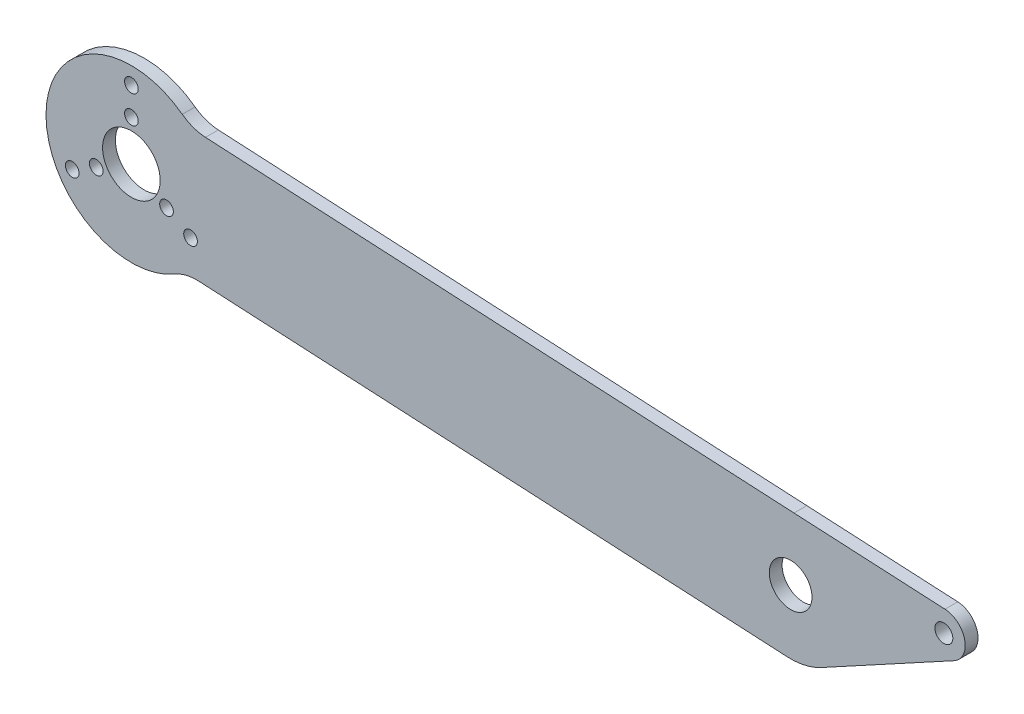
ISO-10303-21;
HEADER;
FILE_DESCRIPTION(('STEP AP214'),'2;1');
FILE_NAME('part.step','',(''),(''),'','','');
FILE_SCHEMA(('AUTOMOTIVE_DESIGN { 1 0 10303 214 1 1 1 1 }'));
ENDSEC;
DATA;
#1=APPLICATION_CONTEXT('core data for automotive mechanical design processes');
#2=APPLICATION_PROTOCOL_DEFINITION('international standard','automotive_design',2000,#1);
#3=PRODUCT_CONTEXT('',#1,'mechanical');
#4=PRODUCT('Part','Part','',(#3));
#5=PRODUCT_RELATED_PRODUCT_CATEGORY('part','',(#4));
#6=PRODUCT_DEFINITION_FORMATION('','',#4);
#7=PRODUCT_DEFINITION_CONTEXT('part definition',#1,'design');
#8=PRODUCT_DEFINITION('design','',#6,#7);
#9=PRODUCT_DEFINITION_SHAPE('','',#8);
#10=(LENGTH_UNIT() NAMED_UNIT(*) SI_UNIT(.MILLI.,.METRE.));
#11=(NAMED_UNIT(*) PLANE_ANGLE_UNIT() SI_UNIT($,.RADIAN.));
#12=(NAMED_UNIT(*) SI_UNIT($,.STERADIAN.) SOLID_ANGLE_UNIT());
#13=UNCERTAINTY_MEASURE_WITH_UNIT(LENGTH_MEASURE(1.E-05),#10,'distance_accuracy_value','');
#14=(GEOMETRIC_REPRESENTATION_CONTEXT(3) GLOBAL_UNCERTAINTY_ASSIGNED_CONTEXT((#13)) GLOBAL_UNIT_ASSIGNED_CONTEXT((#10,
#11,#12)) REPRESENTATION_CONTEXT('',''));
#15=CARTESIAN_POINT('',(0.,0.,0.));
#16=DIRECTION('',(0.,0.,1.));
#17=DIRECTION('',(1.,0.,0.));
#18=AXIS2_PLACEMENT_3D('',#15,#16,#17);
#19=CARTESIAN_POINT('',(15.241508082376,-25.839822587914,3.));
#20=DIRECTION('',(0.,0.,-1.));
#21=DIRECTION('',(-1.,0.,0.));
#22=AXIS2_PLACEMENT_3D('',#19,#20,#21);
#23=CYLINDRICAL_SURFACE('',#22,10.);
#24=DIRECTION('',(0.,0.,1.));
#25=VECTOR('',#24,1.);
#26=CARTESIAN_POINT('',(15.7689222913527,-15.853740560804,3.));
#27=LINE('',#26,#25);
#28=CARTESIAN_POINT('',(15.7689222913527,-15.853740560804,3.));
#29=VERTEX_POINT('',#28);
#30=CARTESIAN_POINT('',(15.7689222913527,-15.853740560804,0.));
#31=VERTEX_POINT('',#30);
#32=EDGE_CURVE('E154',#29,#31,#27,.F.);
#33=ORIENTED_EDGE('',*,*,#32,.F.);
#34=CARTESIAN_POINT('',(15.241508082376,-25.839822587914,3.));
#35=DIRECTION('',(0.,0.,1.));
#36=DIRECTION('',(1.,0.,0.));
#37=AXIS2_PLACEMENT_3D('',#34,#35,#36);
#38=CIRCLE('',#37,10.);
#39=CARTESIAN_POINT('',(10.1610053882507,-17.2265483919426,3.));
#40=VERTEX_POINT('',#39);
#41=EDGE_CURVE('E51',#29,#40,#38,.T.);
#42=ORIENTED_EDGE('',*,*,#41,.T.);
#43=DIRECTION('',(0.,0.,-1.));
#44=VECTOR('',#43,1.);
#45=CARTESIAN_POINT('',(10.1610053882507,-17.2265483919427,3.));
#46=LINE('',#45,#44);
#47=CARTESIAN_POINT('',(10.1610053882507,-17.2265483919426,0.));
#48=VERTEX_POINT('',#47);
#49=EDGE_CURVE('E157',#48,#40,#46,.F.);
#50=ORIENTED_EDGE('',*,*,#49,.F.);
#51=CARTESIAN_POINT('',(15.241508082376,-25.839822587914,0.));
#52=DIRECTION('',(0.,0.,1.));
#53=DIRECTION('',(1.,0.,0.));
#54=AXIS2_PLACEMENT_3D('',#51,#52,#53);
#55=CIRCLE('',#54,10.);
#56=EDGE_CURVE('E11',#48,#31,#55,.F.);
#57=ORIENTED_EDGE('',*,*,#56,.T.);
#58=EDGE_LOOP('',(#33,#42,#50,#57));
#59=FACE_BOUND('',#58,.T.);
#60=ADVANCED_FACE('F44',(#59),#23,.F.);
#61=CARTESIAN_POINT('',(17.8785791272596,24.0905875476361,3.));
#62=DIRECTION('',(0.,0.,-1.));
#63=DIRECTION('',(-1.,0.,0.));
#64=AXIS2_PLACEMENT_3D('',#61,#62,#63);
#65=CYLINDRICAL_SURFACE('',#64,10.);
#66=DIRECTION('',(0.,0.,-1.));
#67=VECTOR('',#66,1.);
#68=CARTESIAN_POINT('',(11.9190527515064,16.0603916984241,3.));
#69=LINE('',#68,#67);
#70=CARTESIAN_POINT('',(11.9190527515064,16.0603916984241,3.));
#71=VERTEX_POINT('',#70);
#72=CARTESIAN_POINT('',(11.9190527515064,16.0603916984241,0.));
#73=VERTEX_POINT('',#72);
#74=EDGE_CURVE('E139',#71,#73,#69,.T.);
#75=ORIENTED_EDGE('',*,*,#74,.F.);
#76=CARTESIAN_POINT('',(17.8785791272596,24.0905875476361,3.));
#77=DIRECTION('',(0.,0.,1.));
#78=DIRECTION('',(1.,0.,0.));
#79=AXIS2_PLACEMENT_3D('',#76,#77,#78);
#80=CIRCLE('',#79,10.);
#81=CARTESIAN_POINT('',(17.3511649182829,14.1045055205261,3.));
#82=VERTEX_POINT('',#81);
#83=EDGE_CURVE('E150',#71,#82,#80,.T.);
#84=ORIENTED_EDGE('',*,*,#83,.T.);
#85=DIRECTION('',(0.,0.,1.));
#86=VECTOR('',#85,1.);
#87=CARTESIAN_POINT('',(17.3511649182829,14.1045055205261,3.));
#88=LINE('',#87,#86);
#89=CARTESIAN_POINT('',(17.3511649182829,14.1045055205261,0.));
#90=VERTEX_POINT('',#89);
#91=EDGE_CURVE('E142',#90,#82,#88,.T.);
#92=ORIENTED_EDGE('',*,*,#91,.F.);
#93=CARTESIAN_POINT('',(17.8785791272596,24.0905875476361,0.));
#94=DIRECTION('',(0.,0.,1.));
#95=DIRECTION('',(1.,0.,0.));
#96=AXIS2_PLACEMENT_3D('',#93,#94,#95);
#97=CIRCLE('',#96,10.);
#98=EDGE_CURVE('E152',#90,#73,#97,.F.);
#99=ORIENTED_EDGE('',*,*,#98,.T.);
#100=EDGE_LOOP('',(#75,#84,#92,#99));
#101=FACE_BOUND('',#100,.T.);
#102=ADVANCED_FACE('F219',(#101),#65,.F.);
#103=CARTESIAN_POINT('',(190.28,0.,3.));
#104=DIRECTION('',(0.,0.,1.));
#105=DIRECTION('',(1.,0.,0.));
#106=AXIS2_PLACEMENT_3D('',#103,#104,#105);
#107=PLANE('',#106);
#108=ORIENTED_EDGE('',*,*,#41,.F.);
#109=DIRECTION('',(0.998608202711,-0.0527414208976724,0.));
#110=VECTOR('',#109,1.);
#111=CARTESIAN_POINT('',(12.4192234943473,-15.6768264581021,3.));
#112=LINE('',#111,#110);
#113=CARTESIAN_POINT('',(153.603692907683,-23.1334741256541,3.));
#114=VERTEX_POINT('',#113);
#115=EDGE_CURVE('E166',#29,#114,#112,.T.);
#116=ORIENTED_EDGE('',*,*,#115,.T.);
#117=CARTESIAN_POINT('',(154.394814221148,-8.15435108498915,3.));
#118=DIRECTION('',(0.,0.,1.));
#119=DIRECTION('',(1.,0.,0.));
#120=AXIS2_PLACEMENT_3D('',#117,#118,#119);
#121=CIRCLE('',#120,15.);
#122=CARTESIAN_POINT('',(161.568286956574,-21.3278581698202,3.));
#123=VERTEX_POINT('',#122);
#124=EDGE_CURVE('E168',#114,#123,#121,.T.);
#125=ORIENTED_EDGE('',*,*,#124,.T.);
#126=DIRECTION('',(0.878233805655407,0.478231515695088,0.));
#127=VECTOR('',#126,1.);
#128=CARTESIAN_POINT('',(161.568286956574,-21.3278581698202,3.));
#129=LINE('',#128,#127);
#130=CARTESIAN_POINT('',(192.671157578475,-4.39116902827702,3.));
#131=VERTEX_POINT('',#130);
#132=EDGE_CURVE('E130',#123,#131,#129,.T.);
#133=ORIENTED_EDGE('',*,*,#132,.T.);
#134=CARTESIAN_POINT('',(190.28,0.,3.));
#135=DIRECTION('',(0.,0.,1.));
#136=DIRECTION('',(1.,0.,0.));
#137=AXIS2_PLACEMENT_3D('',#134,#135,#136);
#138=CIRCLE('',#137,4.99999999999999);
#139=CARTESIAN_POINT('',(190.538680800823,4.99330394060743,3.));
#140=VERTEX_POINT('',#139);
#141=EDGE_CURVE('E124',#131,#140,#138,.T.);
#142=ORIENTED_EDGE('',*,*,#141,.T.);
#143=DIRECTION('',(-0.998660788121489,0.0517361601645036,0.));
#144=VECTOR('',#143,1.);
#145=CARTESIAN_POINT('',(190.538680800823,4.99330394060743,3.));
#146=LINE('',#145,#144);
#147=CARTESIAN_POINT('',(155.185935534613,6.82477195567584,3.));
#148=VERTEX_POINT('',#147);
#149=EDGE_CURVE('E112',#140,#148,#146,.T.);
#150=ORIENTED_EDGE('',*,*,#149,.T.);
#151=DIRECTION('',(-0.998608202711,0.0527414208976726,0.));
#152=VECTOR('',#151,1.);
#153=CARTESIAN_POINT('',(14.0014661212776,14.2814196232279,3.));
#154=LINE('',#153,#152);
#155=EDGE_CURVE('E123',#148,#82,#154,.T.);
#156=ORIENTED_EDGE('',*,*,#155,.T.);
#157=ORIENTED_EDGE('',*,*,#83,.F.);
#158=CARTESIAN_POINT('',(0.,0.,3.));
#159=DIRECTION('',(0.,0.,1.));
#160=DIRECTION('',(1.,0.,0.));
#161=AXIS2_PLACEMENT_3D('',#158,#159,#160);
#162=CIRCLE('',#161,20.);
#163=EDGE_CURVE('E163',#71,#40,#162,.T.);
#164=ORIENTED_EDGE('',*,*,#163,.T.);
#165=EDGE_LOOP('',(#108,#116,#125,#133,#142,#150,#156,#157,#164));
#166=FACE_BOUND('',#165,.T.);
#167=CARTESIAN_POINT('',(13.856406460551,-8.00000000000007,3.));
#168=DIRECTION('',(0.,0.,1.));
#169=DIRECTION('',(1.,0.,0.));
#170=AXIS2_PLACEMENT_3D('',#167,#168,#169);
#171=CIRCLE('',#170,1.6);
#172=CARTESIAN_POINT('',(15.456406460551,-8.00000000000007,3.));
#173=VERTEX_POINT('',#172);
#174=EDGE_CURVE('E290',#173,#173,#171,.T.);
#175=ORIENTED_EDGE('',*,*,#174,.F.);
#176=EDGE_LOOP('',(#175));
#177=FACE_BOUND('',#176,.T.);
#178=CARTESIAN_POINT('',(8.22724133595215,-4.75000000000004,3.));
#179=DIRECTION('',(0.,0.,1.));
#180=DIRECTION('',(1.,0.,0.));
#181=AXIS2_PLACEMENT_3D('',#178,#179,#180);
#182=CIRCLE('',#181,1.6);
#183=CARTESIAN_POINT('',(9.82724133595215,-4.75000000000004,3.));
#184=VERTEX_POINT('',#183);
#185=EDGE_CURVE('E302',#184,#184,#182,.T.);
#186=ORIENTED_EDGE('',*,*,#185,.F.);
#187=EDGE_LOOP('',(#186));
#188=FACE_BOUND('',#187,.T.);
#189=CARTESIAN_POINT('',(0.,9.5,3.));
#190=DIRECTION('',(0.,0.,1.));
#191=DIRECTION('',(1.,0.,0.));
#192=AXIS2_PLACEMENT_3D('',#189,#190,#191);
#193=CIRCLE('',#192,1.6);
#194=CARTESIAN_POINT('',(1.6,9.5,3.));
#195=VERTEX_POINT('',#194);
#196=EDGE_CURVE('E314',#195,#195,#193,.T.);
#197=ORIENTED_EDGE('',*,*,#196,.F.);
#198=EDGE_LOOP('',(#197));
#199=FACE_BOUND('',#198,.T.);
#200=CARTESIAN_POINT('',(190.28,0.,3.));
#201=DIRECTION('',(0.,0.,1.));
#202=DIRECTION('',(1.,0.,0.));
#203=AXIS2_PLACEMENT_3D('',#200,#201,#202);
#204=CIRCLE('',#203,2.09999999999999);
#205=CARTESIAN_POINT('',(192.38,0.,3.));
#206=VERTEX_POINT('',#205);
#207=EDGE_CURVE('E326',#206,#206,#204,.T.);
#208=ORIENTED_EDGE('',*,*,#207,.F.);
#209=EDGE_LOOP('',(#208));
#210=FACE_BOUND('',#209,.T.);
#211=CARTESIAN_POINT('',(154.394814221148,-8.15435108498915,3.));
#212=DIRECTION('',(0.,0.,1.));
#213=DIRECTION('',(1.,0.,0.));
#214=AXIS2_PLACEMENT_3D('',#211,#212,#213);
#215=CIRCLE('',#214,4.99999999999999);
#216=CARTESIAN_POINT('',(159.394814221148,-8.15435108498915,3.));
#217=VERTEX_POINT('',#216);
#218=EDGE_CURVE('E177',#217,#217,#215,.T.);
#219=ORIENTED_EDGE('',*,*,#218,.F.);
#220=EDGE_LOOP('',(#219));
#221=FACE_BOUND('',#220,.T.);
#222=CARTESIAN_POINT('',(0.,0.,3.));
#223=DIRECTION('',(0.,0.,1.));
#224=DIRECTION('',(1.,0.,0.));
#225=AXIS2_PLACEMENT_3D('',#222,#223,#224);
#226=CIRCLE('',#225,6.75);
#227=CARTESIAN_POINT('',(6.75,0.,3.));
#228=VERTEX_POINT('',#227);
#229=EDGE_CURVE('E320',#228,#228,#226,.T.);
#230=ORIENTED_EDGE('',*,*,#229,.F.);
#231=EDGE_LOOP('',(#230));
#232=FACE_BOUND('',#231,.T.);
#233=CARTESIAN_POINT('',(0.,16.,3.));
#234=DIRECTION('',(0.,0.,1.));
#235=DIRECTION('',(1.,0.,0.));
#236=AXIS2_PLACEMENT_3D('',#233,#234,#235);
#237=CIRCLE('',#236,1.6);
#238=CARTESIAN_POINT('',(1.6,16.,3.));
#239=VERTEX_POINT('',#238);
#240=EDGE_CURVE('E308',#239,#239,#237,.T.);
#241=ORIENTED_EDGE('',*,*,#240,.F.);
#242=EDGE_LOOP('',(#241));
#243=FACE_BOUND('',#242,.T.);
#244=CARTESIAN_POINT('',(-8.22724133595221,-4.74999999999992,3.));
#245=DIRECTION('',(0.,0.,1.));
#246=DIRECTION('',(1.,0.,0.));
#247=AXIS2_PLACEMENT_3D('',#244,#245,#246);
#248=CIRCLE('',#247,1.6);
#249=CARTESIAN_POINT('',(-6.62724133595221,-4.74999999999992,3.));
#250=VERTEX_POINT('',#249);
#251=EDGE_CURVE('E296',#250,#250,#248,.T.);
#252=ORIENTED_EDGE('',*,*,#251,.F.);
#253=EDGE_LOOP('',(#252));
#254=FACE_BOUND('',#253,.T.);
#255=CARTESIAN_POINT('',(-13.8564064605511,-7.99999999999987,3.));
#256=DIRECTION('',(0.,0.,1.));
#257=DIRECTION('',(1.,0.,0.));
#258=AXIS2_PLACEMENT_3D('',#255,#256,#257);
#259=CIRCLE('',#258,1.6);
#260=CARTESIAN_POINT('',(-12.2564064605511,-7.99999999999987,3.));
#261=VERTEX_POINT('',#260);
#262=EDGE_CURVE('E281',#261,#261,#259,.T.);
#263=ORIENTED_EDGE('',*,*,#262,.F.);
#264=EDGE_LOOP('',(#263));
#265=FACE_BOUND('',#264,.T.);
#266=ADVANCED_FACE('F127',(#166,#177,#188,#199,#210,#221,#232,#243,#254,#265),#107,.T.);
#267=CARTESIAN_POINT('',(190.28,0.,0.));
#268=DIRECTION('',(0.,0.,1.));
#269=DIRECTION('',(1.,0.,0.));
#270=AXIS2_PLACEMENT_3D('',#267,#268,#269);
#271=PLANE('',#270);
#272=CARTESIAN_POINT('',(190.28,0.,0.));
#273=DIRECTION('',(0.,0.,1.));
#274=DIRECTION('',(1.,0.,0.));
#275=AXIS2_PLACEMENT_3D('',#272,#273,#274);
#276=CIRCLE('',#275,4.99999999999999);
#277=CARTESIAN_POINT('',(192.671157578475,-4.39116902827702,0.));
#278=VERTEX_POINT('',#277);
#279=CARTESIAN_POINT('',(190.538680800823,4.99330394060743,0.));
#280=VERTEX_POINT('',#279);
#281=EDGE_CURVE('E138',#278,#280,#276,.T.);
#282=ORIENTED_EDGE('',*,*,#281,.F.);
#283=DIRECTION('',(0.878233805655407,0.478231515695088,0.));
#284=VECTOR('',#283,1.);
#285=CARTESIAN_POINT('',(161.568286956574,-21.3278581698202,0.));
#286=LINE('',#285,#284);
#287=CARTESIAN_POINT('',(161.568286956574,-21.3278581698202,0.));
#288=VERTEX_POINT('',#287);
#289=EDGE_CURVE('E134',#288,#278,#286,.T.);
#290=ORIENTED_EDGE('',*,*,#289,.F.);
#291=CARTESIAN_POINT('',(154.394814221148,-8.15435108498915,0.));
#292=DIRECTION('',(0.,0.,1.));
#293=DIRECTION('',(1.,0.,0.));
#294=AXIS2_PLACEMENT_3D('',#291,#292,#293);
#295=CIRCLE('',#294,15.);
#296=CARTESIAN_POINT('',(153.603692907683,-23.1334741256541,0.));
#297=VERTEX_POINT('',#296);
#298=EDGE_CURVE('E185',#297,#288,#295,.T.);
#299=ORIENTED_EDGE('',*,*,#298,.F.);
#300=DIRECTION('',(0.998608202711,-0.0527414208976724,0.));
#301=VECTOR('',#300,1.);
#302=CARTESIAN_POINT('',(12.4192234943473,-15.6768264581021,0.));
#303=LINE('',#302,#301);
#304=EDGE_CURVE('E183',#31,#297,#303,.T.);
#305=ORIENTED_EDGE('',*,*,#304,.F.);
#306=ORIENTED_EDGE('',*,*,#56,.F.);
#307=CARTESIAN_POINT('',(0.,0.,0.));
#308=DIRECTION('',(0.,0.,1.));
#309=DIRECTION('',(1.,0.,0.));
#310=AXIS2_PLACEMENT_3D('',#307,#308,#309);
#311=CIRCLE('',#310,20.);
#312=EDGE_CURVE('E164',#73,#48,#311,.T.);
#313=ORIENTED_EDGE('',*,*,#312,.F.);
#314=ORIENTED_EDGE('',*,*,#98,.F.);
#315=DIRECTION('',(-0.998608202711,0.0527414208976726,0.));
#316=VECTOR('',#315,1.);
#317=CARTESIAN_POINT('',(14.0014661212776,14.2814196232279,0.));
#318=LINE('',#317,#316);
#319=CARTESIAN_POINT('',(155.185935534613,6.82477195567584,0.));
#320=VERTEX_POINT('',#319);
#321=EDGE_CURVE('E179',#320,#90,#318,.T.);
#322=ORIENTED_EDGE('',*,*,#321,.F.);
#323=DIRECTION('',(-0.998660788121489,0.0517361601645036,0.));
#324=VECTOR('',#323,1.);
#325=CARTESIAN_POINT('',(190.538680800823,4.99330394060743,0.));
#326=LINE('',#325,#324);
#327=EDGE_CURVE('E176',#280,#320,#326,.T.);
#328=ORIENTED_EDGE('',*,*,#327,.F.);
#329=EDGE_LOOP('',(#282,#290,#299,#305,#306,#313,#314,#322,#328));
#330=FACE_BOUND('',#329,.T.);
#331=CARTESIAN_POINT('',(154.394814221148,-8.15435108498915,0.));
#332=DIRECTION('',(0.,0.,1.));
#333=DIRECTION('',(1.,0.,0.));
#334=AXIS2_PLACEMENT_3D('',#331,#332,#333);
#335=CIRCLE('',#334,4.99999999999999);
#336=CARTESIAN_POINT('',(159.394814221148,-8.15435108498915,0.));
#337=VERTEX_POINT('',#336);
#338=EDGE_CURVE('E329',#337,#337,#335,.T.);
#339=ORIENTED_EDGE('',*,*,#338,.T.);
#340=EDGE_LOOP('',(#339));
#341=FACE_BOUND('',#340,.T.);
#342=CARTESIAN_POINT('',(190.28,0.,0.));
#343=DIRECTION('',(0.,0.,1.));
#344=DIRECTION('',(1.,0.,0.));
#345=AXIS2_PLACEMENT_3D('',#342,#343,#344);
#346=CIRCLE('',#345,2.09999999999999);
#347=CARTESIAN_POINT('',(192.38,0.,0.));
#348=VERTEX_POINT('',#347);
#349=EDGE_CURVE('E323',#348,#348,#346,.T.);
#350=ORIENTED_EDGE('',*,*,#349,.T.);
#351=EDGE_LOOP('',(#350));
#352=FACE_BOUND('',#351,.T.);
#353=CARTESIAN_POINT('',(0.,0.,0.));
#354=DIRECTION('',(0.,0.,1.));
#355=DIRECTION('',(1.,0.,0.));
#356=AXIS2_PLACEMENT_3D('',#353,#354,#355);
#357=CIRCLE('',#356,6.75);
#358=CARTESIAN_POINT('',(6.75,0.,0.));
#359=VERTEX_POINT('',#358);
#360=EDGE_CURVE('E317',#359,#359,#357,.T.);
#361=ORIENTED_EDGE('',*,*,#360,.T.);
#362=EDGE_LOOP('',(#361));
#363=FACE_BOUND('',#362,.T.);
#364=CARTESIAN_POINT('',(0.,9.5,0.));
#365=DIRECTION('',(0.,0.,1.));
#366=DIRECTION('',(1.,0.,0.));
#367=AXIS2_PLACEMENT_3D('',#364,#365,#366);
#368=CIRCLE('',#367,1.6);
#369=CARTESIAN_POINT('',(1.6,9.5,0.));
#370=VERTEX_POINT('',#369);
#371=EDGE_CURVE('E311',#370,#370,#368,.T.);
#372=ORIENTED_EDGE('',*,*,#371,.T.);
#373=EDGE_LOOP('',(#372));
#374=FACE_BOUND('',#373,.T.);
#375=CARTESIAN_POINT('',(0.,16.,0.));
#376=DIRECTION('',(0.,0.,1.));
#377=DIRECTION('',(1.,0.,0.));
#378=AXIS2_PLACEMENT_3D('',#375,#376,#377);
#379=CIRCLE('',#378,1.6);
#380=CARTESIAN_POINT('',(1.6,16.,0.));
#381=VERTEX_POINT('',#380);
#382=EDGE_CURVE('E305',#381,#381,#379,.T.);
#383=ORIENTED_EDGE('',*,*,#382,.T.);
#384=EDGE_LOOP('',(#383));
#385=FACE_BOUND('',#384,.T.);
#386=CARTESIAN_POINT('',(8.22724133595215,-4.75000000000004,0.));
#387=DIRECTION('',(0.,0.,1.));
#388=DIRECTION('',(1.,0.,0.));
#389=AXIS2_PLACEMENT_3D('',#386,#387,#388);
#390=CIRCLE('',#389,1.6);
#391=CARTESIAN_POINT('',(9.82724133595215,-4.75000000000004,0.));
#392=VERTEX_POINT('',#391);
#393=EDGE_CURVE('E299',#392,#392,#390,.T.);
#394=ORIENTED_EDGE('',*,*,#393,.T.);
#395=EDGE_LOOP('',(#394));
#396=FACE_BOUND('',#395,.T.);
#397=CARTESIAN_POINT('',(-8.22724133595221,-4.74999999999992,0.));
#398=DIRECTION('',(0.,0.,1.));
#399=DIRECTION('',(1.,0.,0.));
#400=AXIS2_PLACEMENT_3D('',#397,#398,#399);
#401=CIRCLE('',#400,1.6);
#402=CARTESIAN_POINT('',(-6.62724133595221,-4.74999999999992,0.));
#403=VERTEX_POINT('',#402);
#404=EDGE_CURVE('E293',#403,#403,#401,.T.);
#405=ORIENTED_EDGE('',*,*,#404,.T.);
#406=EDGE_LOOP('',(#405));
#407=FACE_BOUND('',#406,.T.);
#408=CARTESIAN_POINT('',(13.856406460551,-8.00000000000007,0.));
#409=DIRECTION('',(0.,0.,1.));
#410=DIRECTION('',(1.,0.,0.));
#411=AXIS2_PLACEMENT_3D('',#408,#409,#410);
#412=CIRCLE('',#411,1.6);
#413=CARTESIAN_POINT('',(15.456406460551,-8.00000000000007,0.));
#414=VERTEX_POINT('',#413);
#415=EDGE_CURVE('E287',#414,#414,#412,.T.);
#416=ORIENTED_EDGE('',*,*,#415,.T.);
#417=EDGE_LOOP('',(#416));
#418=FACE_BOUND('',#417,.T.);
#419=CARTESIAN_POINT('',(-13.8564064605511,-7.99999999999987,0.));
#420=DIRECTION('',(0.,0.,1.));
#421=DIRECTION('',(1.,0.,0.));
#422=AXIS2_PLACEMENT_3D('',#419,#420,#421);
#423=CIRCLE('',#422,1.6);
#424=CARTESIAN_POINT('',(-12.2564064605511,-7.99999999999987,0.));
#425=VERTEX_POINT('',#424);
#426=EDGE_CURVE('E284',#425,#425,#423,.T.);
#427=ORIENTED_EDGE('',*,*,#426,.T.);
#428=EDGE_LOOP('',(#427));
#429=FACE_BOUND('',#428,.T.);
#430=ADVANCED_FACE('F201',(#330,#341,#352,#363,#374,#385,#396,#407,#418,#429),#271,.F.);
#431=CARTESIAN_POINT('',(190.28,0.,3.));
#432=DIRECTION('',(0.,0.,-1.));
#433=DIRECTION('',(-1.,0.,0.));
#434=AXIS2_PLACEMENT_3D('',#431,#432,#433);
#435=CYLINDRICAL_SURFACE('',#434,4.99999999999999);
#436=ORIENTED_EDGE('',*,*,#281,.T.);
#437=DIRECTION('',(0.,0.,-1.));
#438=VECTOR('',#437,1.);
#439=CARTESIAN_POINT('',(190.538680800823,4.99330394060743,3.));
#440=LINE('',#439,#438);
#441=EDGE_CURVE('E116',#140,#280,#440,.T.);
#442=ORIENTED_EDGE('',*,*,#441,.F.);
#443=ORIENTED_EDGE('',*,*,#141,.F.);
#444=DIRECTION('',(0.,0.,-1.));
#445=VECTOR('',#444,1.);
#446=CARTESIAN_POINT('',(192.671157578475,-4.39116902827702,3.));
#447=LINE('',#446,#445);
#448=EDGE_CURVE('E174',#131,#278,#447,.T.);
#449=ORIENTED_EDGE('',*,*,#448,.T.);
#450=EDGE_LOOP('',(#436,#442,#443,#449));
#451=FACE_BOUND('',#450,.T.);
#452=ADVANCED_FACE('F136',(#451),#435,.T.);
#453=CARTESIAN_POINT('',(190.538680800823,4.99330394060743,3.));
#454=DIRECTION('',(-0.0517361601645036,-0.998660788121489,0.));
#455=DIRECTION('',(0.998660788121489,-0.0517361601645036,0.));
#456=AXIS2_PLACEMENT_3D('',#453,#454,#455);
#457=PLANE('',#456);
#458=ORIENTED_EDGE('',*,*,#327,.T.);
#459=DIRECTION('',(0.,0.,-1.));
#460=VECTOR('',#459,1.);
#461=CARTESIAN_POINT('',(155.185935534613,6.82477195567584,3.));
#462=LINE('',#461,#460);
#463=EDGE_CURVE('E119',#148,#320,#462,.T.);
#464=ORIENTED_EDGE('',*,*,#463,.F.);
#465=ORIENTED_EDGE('',*,*,#149,.F.);
#466=ORIENTED_EDGE('',*,*,#441,.T.);
#467=EDGE_LOOP('',(#458,#464,#465,#466));
#468=FACE_BOUND('',#467,.T.);
#469=ADVANCED_FACE('F114',(#468),#457,.F.);
#470=CARTESIAN_POINT('',(14.0014661212776,14.2814196232279,3.));
#471=DIRECTION('',(-0.0527414208976726,-0.998608202711,0.));
#472=DIRECTION('',(0.998608202711,-0.0527414208976726,0.));
#473=AXIS2_PLACEMENT_3D('',#470,#471,#472);
#474=PLANE('',#473);
#475=ORIENTED_EDGE('',*,*,#321,.T.);
#476=ORIENTED_EDGE('',*,*,#91,.T.);
#477=ORIENTED_EDGE('',*,*,#155,.F.);
#478=ORIENTED_EDGE('',*,*,#463,.T.);
#479=EDGE_LOOP('',(#475,#476,#477,#478));
#480=FACE_BOUND('',#479,.T.);
#481=ADVANCED_FACE('F229',(#480),#474,.F.);
#482=CARTESIAN_POINT('',(0.,0.,3.));
#483=DIRECTION('',(0.,0.,-1.));
#484=DIRECTION('',(-1.,0.,0.));
#485=AXIS2_PLACEMENT_3D('',#482,#483,#484);
#486=CYLINDRICAL_SURFACE('',#485,20.);
#487=ORIENTED_EDGE('',*,*,#312,.T.);
#488=ORIENTED_EDGE('',*,*,#49,.T.);
#489=ORIENTED_EDGE('',*,*,#163,.F.);
#490=ORIENTED_EDGE('',*,*,#74,.T.);
#491=EDGE_LOOP('',(#487,#488,#489,#490));
#492=FACE_BOUND('',#491,.T.);
#493=ADVANCED_FACE('F162',(#492),#486,.T.);
#494=CARTESIAN_POINT('',(12.4192234943473,-15.6768264581021,3.));
#495=DIRECTION('',(0.0527414208976724,0.998608202711,0.));
#496=DIRECTION('',(-0.998608202711,0.0527414208976724,0.));
#497=AXIS2_PLACEMENT_3D('',#494,#495,#496);
#498=PLANE('',#497);
#499=ORIENTED_EDGE('',*,*,#115,.F.);
#500=ORIENTED_EDGE('',*,*,#32,.T.);
#501=ORIENTED_EDGE('',*,*,#304,.T.);
#502=DIRECTION('',(0.,0.,-1.));
#503=VECTOR('',#502,1.);
#504=CARTESIAN_POINT('',(153.603692907683,-23.1334741256541,3.));
#505=LINE('',#504,#503);
#506=EDGE_CURVE('E144',#114,#297,#505,.T.);
#507=ORIENTED_EDGE('',*,*,#506,.F.);
#508=EDGE_LOOP('',(#499,#500,#501,#507));
#509=FACE_BOUND('',#508,.T.);
#510=ADVANCED_FACE('F215',(#509),#498,.F.);
#511=CARTESIAN_POINT('',(154.394814221148,-8.15435108498915,3.));
#512=DIRECTION('',(0.,0.,-1.));
#513=DIRECTION('',(-1.,0.,0.));
#514=AXIS2_PLACEMENT_3D('',#511,#512,#513);
#515=CYLINDRICAL_SURFACE('',#514,15.);
#516=ORIENTED_EDGE('',*,*,#298,.T.);
#517=DIRECTION('',(0.,0.,-1.));
#518=VECTOR('',#517,1.);
#519=CARTESIAN_POINT('',(161.568286956574,-21.3278581698202,3.));
#520=LINE('',#519,#518);
#521=EDGE_CURVE('E189',#123,#288,#520,.T.);
#522=ORIENTED_EDGE('',*,*,#521,.F.);
#523=ORIENTED_EDGE('',*,*,#124,.F.);
#524=ORIENTED_EDGE('',*,*,#506,.T.);
#525=EDGE_LOOP('',(#516,#522,#523,#524));
#526=FACE_BOUND('',#525,.T.);
#527=ADVANCED_FACE('F196',(#526),#515,.T.);
#528=CARTESIAN_POINT('',(161.568286956574,-21.3278581698202,3.));
#529=DIRECTION('',(-0.478231515695088,0.878233805655407,0.));
#530=DIRECTION('',(-0.878233805655407,-0.478231515695088,0.));
#531=AXIS2_PLACEMENT_3D('',#528,#529,#530);
#532=PLANE('',#531);
#533=ORIENTED_EDGE('',*,*,#289,.T.);
#534=ORIENTED_EDGE('',*,*,#448,.F.);
#535=ORIENTED_EDGE('',*,*,#132,.F.);
#536=ORIENTED_EDGE('',*,*,#521,.T.);
#537=EDGE_LOOP('',(#533,#534,#535,#536));
#538=FACE_BOUND('',#537,.T.);
#539=ADVANCED_FACE('F204',(#538),#532,.F.);
#540=CARTESIAN_POINT('',(154.394814221148,-8.15435108498915,3.));
#541=DIRECTION('',(0.,0.,-1.));
#542=DIRECTION('',(-1.,0.,0.));
#543=AXIS2_PLACEMENT_3D('',#540,#541,#542);
#544=CYLINDRICAL_SURFACE('',#543,4.99999999999999);
#545=ORIENTED_EDGE('',*,*,#218,.T.);
#546=EDGE_LOOP('',(#545));
#547=FACE_BOUND('',#546,.T.);
#548=ORIENTED_EDGE('',*,*,#338,.F.);
#549=EDGE_LOOP('',(#548));
#550=FACE_BOUND('',#549,.T.);
#551=ADVANCED_FACE('F206',(#547,#550),#544,.F.);
#552=CARTESIAN_POINT('',(190.28,0.,3.));
#553=DIRECTION('',(0.,0.,-1.));
#554=DIRECTION('',(-1.,0.,0.));
#555=AXIS2_PLACEMENT_3D('',#552,#553,#554);
#556=CYLINDRICAL_SURFACE('',#555,2.09999999999999);
#557=ORIENTED_EDGE('',*,*,#207,.T.);
#558=EDGE_LOOP('',(#557));
#559=FACE_BOUND('',#558,.T.);
#560=ORIENTED_EDGE('',*,*,#349,.F.);
#561=EDGE_LOOP('',(#560));
#562=FACE_BOUND('',#561,.T.);
#563=ADVANCED_FACE('F212',(#559,#562),#556,.F.);
#564=CARTESIAN_POINT('',(0.,0.,3.));
#565=DIRECTION('',(0.,0.,-1.));
#566=DIRECTION('',(-1.,0.,0.));
#567=AXIS2_PLACEMENT_3D('',#564,#565,#566);
#568=CYLINDRICAL_SURFACE('',#567,6.75);
#569=ORIENTED_EDGE('',*,*,#229,.T.);
#570=EDGE_LOOP('',(#569));
#571=FACE_BOUND('',#570,.T.);
#572=ORIENTED_EDGE('',*,*,#360,.F.);
#573=EDGE_LOOP('',(#572));
#574=FACE_BOUND('',#573,.T.);
#575=ADVANCED_FACE('F248',(#571,#574),#568,.F.);
#576=CARTESIAN_POINT('',(0.,9.5,3.));
#577=DIRECTION('',(0.,0.,-1.));
#578=DIRECTION('',(-1.,0.,0.));
#579=AXIS2_PLACEMENT_3D('',#576,#577,#578);
#580=CYLINDRICAL_SURFACE('',#579,1.6);
#581=ORIENTED_EDGE('',*,*,#196,.T.);
#582=EDGE_LOOP('',(#581));
#583=FACE_BOUND('',#582,.T.);
#584=ORIENTED_EDGE('',*,*,#371,.F.);
#585=EDGE_LOOP('',(#584));
#586=FACE_BOUND('',#585,.T.);
#587=ADVANCED_FACE('F252',(#583,#586),#580,.F.);
#588=CARTESIAN_POINT('',(0.,16.,3.));
#589=DIRECTION('',(0.,0.,-1.));
#590=DIRECTION('',(-1.,0.,0.));
#591=AXIS2_PLACEMENT_3D('',#588,#589,#590);
#592=CYLINDRICAL_SURFACE('',#591,1.6);
#593=ORIENTED_EDGE('',*,*,#240,.T.);
#594=EDGE_LOOP('',(#593));
#595=FACE_BOUND('',#594,.T.);
#596=ORIENTED_EDGE('',*,*,#382,.F.);
#597=EDGE_LOOP('',(#596));
#598=FACE_BOUND('',#597,.T.);
#599=ADVANCED_FACE('F256',(#595,#598),#592,.F.);
#600=CARTESIAN_POINT('',(8.22724133595215,-4.75000000000004,3.));
#601=DIRECTION('',(0.,0.,-1.));
#602=DIRECTION('',(-1.,0.,0.));
#603=AXIS2_PLACEMENT_3D('',#600,#601,#602);
#604=CYLINDRICAL_SURFACE('',#603,1.6);
#605=ORIENTED_EDGE('',*,*,#185,.T.);
#606=EDGE_LOOP('',(#605));
#607=FACE_BOUND('',#606,.T.);
#608=ORIENTED_EDGE('',*,*,#393,.F.);
#609=EDGE_LOOP('',(#608));
#610=FACE_BOUND('',#609,.T.);
#611=ADVANCED_FACE('F260',(#607,#610),#604,.F.);
#612=CARTESIAN_POINT('',(-8.22724133595221,-4.74999999999992,3.));
#613=DIRECTION('',(0.,0.,-1.));
#614=DIRECTION('',(-1.,0.,0.));
#615=AXIS2_PLACEMENT_3D('',#612,#613,#614);
#616=CYLINDRICAL_SURFACE('',#615,1.6);
#617=ORIENTED_EDGE('',*,*,#251,.T.);
#618=EDGE_LOOP('',(#617));
#619=FACE_BOUND('',#618,.T.);
#620=ORIENTED_EDGE('',*,*,#404,.F.);
#621=EDGE_LOOP('',(#620));
#622=FACE_BOUND('',#621,.T.);
#623=ADVANCED_FACE('F264',(#619,#622),#616,.F.);
#624=CARTESIAN_POINT('',(13.856406460551,-8.00000000000007,3.));
#625=DIRECTION('',(0.,0.,-1.));
#626=DIRECTION('',(-1.,0.,0.));
#627=AXIS2_PLACEMENT_3D('',#624,#625,#626);
#628=CYLINDRICAL_SURFACE('',#627,1.6);
#629=ORIENTED_EDGE('',*,*,#174,.T.);
#630=EDGE_LOOP('',(#629));
#631=FACE_BOUND('',#630,.T.);
#632=ORIENTED_EDGE('',*,*,#415,.F.);
#633=EDGE_LOOP('',(#632));
#634=FACE_BOUND('',#633,.T.);
#635=ADVANCED_FACE('F268',(#631,#634),#628,.F.);
#636=CARTESIAN_POINT('',(-13.8564064605511,-7.99999999999987,3.));
#637=DIRECTION('',(0.,0.,-1.));
#638=DIRECTION('',(-1.,0.,0.));
#639=AXIS2_PLACEMENT_3D('',#636,#637,#638);
#640=CYLINDRICAL_SURFACE('',#639,1.6);
#641=ORIENTED_EDGE('',*,*,#262,.T.);
#642=EDGE_LOOP('',(#641));
#643=FACE_BOUND('',#642,.T.);
#644=ORIENTED_EDGE('',*,*,#426,.F.);
#645=EDGE_LOOP('',(#644));
#646=FACE_BOUND('',#645,.T.);
#647=ADVANCED_FACE('F272',(#643,#646),#640,.F.);
#648=CLOSED_SHELL('',(#60,#102,#266,#430,#452,#469,#481,#493,#510,#527,#539,#551,#563,#575,#587,
#599,#611,#623,#635,#647));
#649=MANIFOLD_SOLID_BREP('B2',#648);
#650=ADVANCED_BREP_SHAPE_REPRESENTATION('',(#18,#649),#14);
#651=SHAPE_DEFINITION_REPRESENTATION(#9,#650);
ENDSEC;
END-ISO-10303-21;
